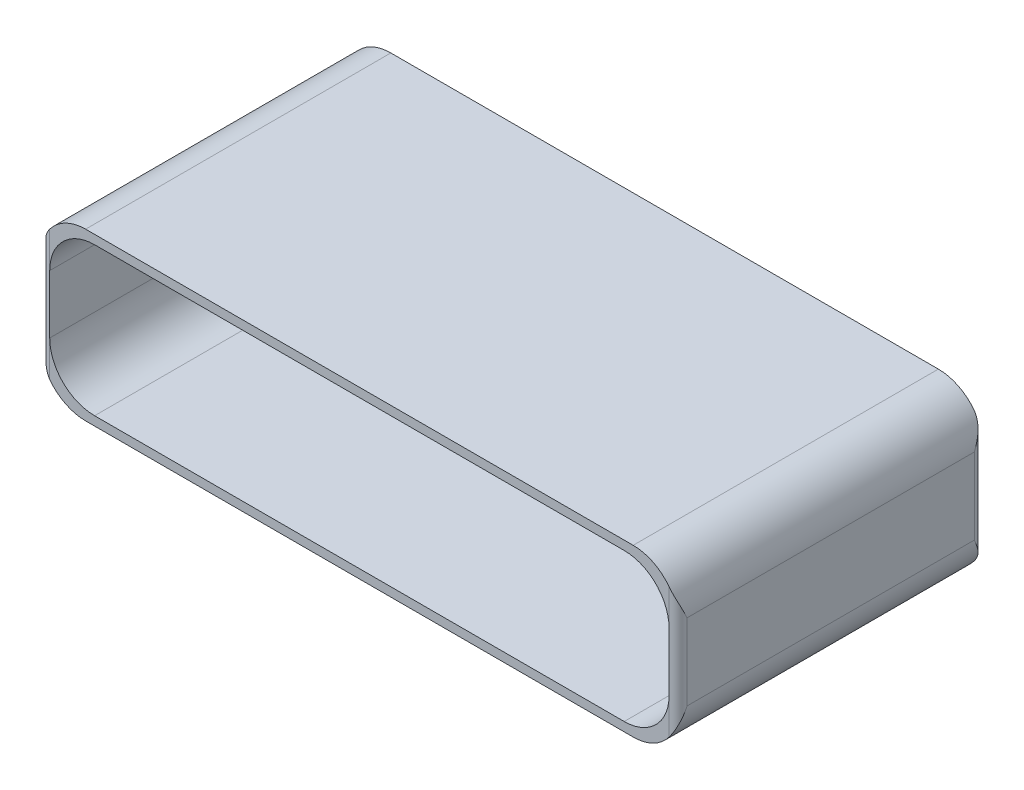
ISO-10303-21;
HEADER;
FILE_DESCRIPTION(('STEP AP214'),'2;1');
FILE_NAME('part.step','',(''),(''),'','','');
FILE_SCHEMA(('AUTOMOTIVE_DESIGN { 1 0 10303 214 1 1 1 1 }'));
ENDSEC;
DATA;
#1=APPLICATION_CONTEXT('core data for automotive mechanical design processes');
#2=APPLICATION_PROTOCOL_DEFINITION('international standard','automotive_design',2000,#1);
#3=PRODUCT_CONTEXT('',#1,'mechanical');
#4=PRODUCT('Part','Part','',(#3));
#5=PRODUCT_RELATED_PRODUCT_CATEGORY('part','',(#4));
#6=PRODUCT_DEFINITION_FORMATION('','',#4);
#7=PRODUCT_DEFINITION_CONTEXT('part definition',#1,'design');
#8=PRODUCT_DEFINITION('design','',#6,#7);
#9=PRODUCT_DEFINITION_SHAPE('','',#8);
#10=(LENGTH_UNIT() NAMED_UNIT(*) SI_UNIT(.MILLI.,.METRE.));
#11=(NAMED_UNIT(*) PLANE_ANGLE_UNIT() SI_UNIT($,.RADIAN.));
#12=(NAMED_UNIT(*) SI_UNIT($,.STERADIAN.) SOLID_ANGLE_UNIT());
#13=UNCERTAINTY_MEASURE_WITH_UNIT(LENGTH_MEASURE(1.E-05),#10,'distance_accuracy_value','');
#14=(GEOMETRIC_REPRESENTATION_CONTEXT(3) GLOBAL_UNCERTAINTY_ASSIGNED_CONTEXT((#13)) GLOBAL_UNIT_ASSIGNED_CONTEXT((#10,
#11,#12)) REPRESENTATION_CONTEXT('',''));
#15=CARTESIAN_POINT('',(0.,0.,0.));
#16=DIRECTION('',(0.,0.,1.));
#17=DIRECTION('',(1.,0.,0.));
#18=AXIS2_PLACEMENT_3D('',#15,#16,#17);
#19=CARTESIAN_POINT('',(-30.5,4.25,34.));
#20=DIRECTION('',(0.,0.,1.));
#21=DIRECTION('',(1.,0.,0.));
#22=AXIS2_PLACEMENT_3D('',#19,#20,#21);
#23=PLANE('',#22);
#24=DIRECTION('',(0.,1.,0.));
#25=VECTOR('',#24,1.);
#26=CARTESIAN_POINT('',(-34.5,-17.,34.));
#27=LINE('',#26,#25);
#28=CARTESIAN_POINT('',(-34.5,-7.25000000000001,34.));
#29=VERTEX_POINT('',#28);
#30=CARTESIAN_POINT('',(-34.5,-3.25,34.));
#31=VERTEX_POINT('',#30);
#32=EDGE_CURVE('E466',#29,#31,#27,.T.);
#33=ORIENTED_EDGE('',*,*,#32,.F.);
#34=CARTESIAN_POINT('',(-30.5,-4.25,34.));
#35=DIRECTION('',(0.,0.,1.));
#36=DIRECTION('',(-1.,0.,0.));
#37=AXIS2_PLACEMENT_3D('',#34,#35,#36);
#38=CIRCLE('',#37,5.);
#39=CARTESIAN_POINT('',(-30.5,-9.25,34.));
#40=VERTEX_POINT('',#39);
#41=EDGE_CURVE('E95',#29,#40,#38,.T.);
#42=ORIENTED_EDGE('',*,*,#41,.T.);
#43=DIRECTION('',(1.,0.,0.));
#44=VECTOR('',#43,1.);
#45=CARTESIAN_POINT('',(30.4999999999999,-9.24999999999999,34.));
#46=LINE('',#45,#44);
#47=CARTESIAN_POINT('',(30.4999999999999,-9.24999999999999,34.));
#48=VERTEX_POINT('',#47);
#49=EDGE_CURVE('E398',#40,#48,#46,.T.);
#50=ORIENTED_EDGE('',*,*,#49,.T.);
#51=CARTESIAN_POINT('',(30.5,-4.24999999999999,34.));
#52=DIRECTION('',(0.,0.,1.));
#53=DIRECTION('',(1.,0.,0.));
#54=AXIS2_PLACEMENT_3D('',#51,#52,#53);
#55=CIRCLE('',#54,5.);
#56=CARTESIAN_POINT('',(34.5,-7.25,34.));
#57=VERTEX_POINT('',#56);
#58=EDGE_CURVE('E400',#48,#57,#55,.T.);
#59=ORIENTED_EDGE('',*,*,#58,.T.);
#60=DIRECTION('',(0.,1.,0.));
#61=VECTOR('',#60,1.);
#62=CARTESIAN_POINT('',(34.5,-17.,34.));
#63=LINE('',#62,#61);
#64=CARTESIAN_POINT('',(34.5,-3.24999999999996,34.));
#65=VERTEX_POINT('',#64);
#66=EDGE_CURVE('E412',#57,#65,#63,.T.);
#67=ORIENTED_EDGE('',*,*,#66,.T.);
#68=CARTESIAN_POINT('',(29.5,-3.25,34.));
#69=DIRECTION('',(0.,0.,1.));
#70=DIRECTION('',(1.,0.,0.));
#71=AXIS2_PLACEMENT_3D('',#68,#69,#70);
#72=CIRCLE('',#71,5.);
#73=CARTESIAN_POINT('',(29.5,-8.25,34.));
#74=VERTEX_POINT('',#73);
#75=EDGE_CURVE('E352',#74,#65,#72,.T.);
#76=ORIENTED_EDGE('',*,*,#75,.F.);
#77=DIRECTION('',(1.,0.,0.));
#78=VECTOR('',#77,1.);
#79=CARTESIAN_POINT('',(29.5,-8.25,34.));
#80=LINE('',#79,#78);
#81=CARTESIAN_POINT('',(-29.5,-8.25,34.));
#82=VERTEX_POINT('',#81);
#83=EDGE_CURVE('E350',#82,#74,#80,.T.);
#84=ORIENTED_EDGE('',*,*,#83,.F.);
#85=CARTESIAN_POINT('',(-29.5,-3.25,34.));
#86=DIRECTION('',(0.,0.,1.));
#87=DIRECTION('',(-1.,0.,0.));
#88=AXIS2_PLACEMENT_3D('',#85,#86,#87);
#89=CIRCLE('',#88,5.);
#90=EDGE_CURVE('E348',#31,#82,#89,.T.);
#91=ORIENTED_EDGE('',*,*,#90,.F.);
#92=EDGE_LOOP('',(#33,#42,#50,#59,#67,#76,#84,#91));
#93=FACE_BOUND('',#92,.T.);
#94=ADVANCED_FACE('F45',(#93),#23,.T.);
#95=CARTESIAN_POINT('',(-34.5,3.24999999999997,34.));
#96=VERTEX_POINT('',#95);
#97=CARTESIAN_POINT('',(-34.5,7.25000000000001,34.));
#98=VERTEX_POINT('',#97);
#99=EDGE_CURVE('E469',#96,#98,#27,.T.);
#100=ORIENTED_EDGE('',*,*,#99,.F.);
#101=CARTESIAN_POINT('',(-29.5,3.25,34.));
#102=DIRECTION('',(0.,0.,1.));
#103=DIRECTION('',(1.,0.,0.));
#104=AXIS2_PLACEMENT_3D('',#101,#102,#103);
#105=CIRCLE('',#104,5.);
#106=CARTESIAN_POINT('',(-29.5,8.25,34.));
#107=VERTEX_POINT('',#106);
#108=EDGE_CURVE('E342',#107,#96,#105,.T.);
#109=ORIENTED_EDGE('',*,*,#108,.F.);
#110=DIRECTION('',(-1.,0.,0.));
#111=VECTOR('',#110,1.);
#112=CARTESIAN_POINT('',(29.5,8.25,34.));
#113=LINE('',#112,#111);
#114=CARTESIAN_POINT('',(29.5,8.25,34.));
#115=VERTEX_POINT('',#114);
#116=EDGE_CURVE('E339',#115,#107,#113,.T.);
#117=ORIENTED_EDGE('',*,*,#116,.F.);
#118=CARTESIAN_POINT('',(29.5,3.25,34.));
#119=DIRECTION('',(0.,0.,1.));
#120=DIRECTION('',(1.,0.,0.));
#121=AXIS2_PLACEMENT_3D('',#118,#119,#120);
#122=CIRCLE('',#121,5.);
#123=CARTESIAN_POINT('',(34.5,3.24999999999996,34.));
#124=VERTEX_POINT('',#123);
#125=EDGE_CURVE('E337',#124,#115,#122,.T.);
#126=ORIENTED_EDGE('',*,*,#125,.F.);
#127=CARTESIAN_POINT('',(34.5,7.25000000000002,34.));
#128=VERTEX_POINT('',#127);
#129=EDGE_CURVE('E464',#124,#128,#63,.T.);
#130=ORIENTED_EDGE('',*,*,#129,.T.);
#131=CARTESIAN_POINT('',(30.5,4.25000000000001,34.));
#132=DIRECTION('',(0.,0.,1.));
#133=DIRECTION('',(1.,0.,0.));
#134=AXIS2_PLACEMENT_3D('',#131,#132,#133);
#135=CIRCLE('',#134,5.);
#136=CARTESIAN_POINT('',(30.4999999999999,9.25000000000001,34.));
#137=VERTEX_POINT('',#136);
#138=EDGE_CURVE('E403',#128,#137,#135,.T.);
#139=ORIENTED_EDGE('',*,*,#138,.T.);
#140=DIRECTION('',(-1.,0.,0.));
#141=VECTOR('',#140,1.);
#142=CARTESIAN_POINT('',(30.4999999999999,9.25000000000001,34.));
#143=LINE('',#142,#141);
#144=CARTESIAN_POINT('',(-30.5,9.25,34.));
#145=VERTEX_POINT('',#144);
#146=EDGE_CURVE('E63',#137,#145,#143,.T.);
#147=ORIENTED_EDGE('',*,*,#146,.T.);
#148=CARTESIAN_POINT('',(-30.5,4.25,34.));
#149=DIRECTION('',(0.,0.,1.));
#150=DIRECTION('',(1.,0.,0.));
#151=AXIS2_PLACEMENT_3D('',#148,#149,#150);
#152=CIRCLE('',#151,5.);
#153=EDGE_CURVE('E233',#145,#98,#152,.T.);
#154=ORIENTED_EDGE('',*,*,#153,.T.);
#155=EDGE_LOOP('',(#100,#109,#117,#126,#130,#139,#147,#154));
#156=FACE_BOUND('',#155,.T.);
#157=ADVANCED_FACE('F435',(#156),#23,.T.);
#158=CARTESIAN_POINT('',(-30.5,4.25,0.));
#159=DIRECTION('',(0.,0.,1.));
#160=DIRECTION('',(1.,0.,0.));
#161=AXIS2_PLACEMENT_3D('',#158,#159,#160);
#162=PLANE('',#161);
#163=CARTESIAN_POINT('',(30.5,4.25000000000001,0.));
#164=DIRECTION('',(0.,0.,1.));
#165=DIRECTION('',(1.,0.,0.));
#166=AXIS2_PLACEMENT_3D('',#163,#164,#165);
#167=CIRCLE('',#166,5.);
#168=CARTESIAN_POINT('',(34.5,7.25000000000001,0.));
#169=VERTEX_POINT('',#168);
#170=CARTESIAN_POINT('',(30.4999999999999,9.25000000000001,0.));
#171=VERTEX_POINT('',#170);
#172=EDGE_CURVE('E81',#169,#171,#167,.T.);
#173=ORIENTED_EDGE('',*,*,#172,.F.);
#174=DIRECTION('',(0.,1.,0.));
#175=VECTOR('',#174,1.);
#176=CARTESIAN_POINT('',(34.5,-17.,0.));
#177=LINE('',#176,#175);
#178=CARTESIAN_POINT('',(34.5,3.24999999999996,0.));
#179=VERTEX_POINT('',#178);
#180=EDGE_CURVE('E217',#179,#169,#177,.T.);
#181=ORIENTED_EDGE('',*,*,#180,.F.);
#182=CARTESIAN_POINT('',(29.5,3.25,0.));
#183=DIRECTION('',(0.,0.,1.));
#184=DIRECTION('',(1.,0.,0.));
#185=AXIS2_PLACEMENT_3D('',#182,#183,#184);
#186=CIRCLE('',#185,5.);
#187=CARTESIAN_POINT('',(29.5,8.25,0.));
#188=VERTEX_POINT('',#187);
#189=EDGE_CURVE('E336',#179,#188,#186,.T.);
#190=ORIENTED_EDGE('',*,*,#189,.T.);
#191=DIRECTION('',(-1.,0.,0.));
#192=VECTOR('',#191,1.);
#193=CARTESIAN_POINT('',(29.5,8.25,0.));
#194=LINE('',#193,#192);
#195=CARTESIAN_POINT('',(-29.5,8.25,0.));
#196=VERTEX_POINT('',#195);
#197=EDGE_CURVE('E361',#188,#196,#194,.T.);
#198=ORIENTED_EDGE('',*,*,#197,.T.);
#199=CARTESIAN_POINT('',(-29.5,3.25,0.));
#200=DIRECTION('',(0.,0.,1.));
#201=DIRECTION('',(1.,0.,0.));
#202=AXIS2_PLACEMENT_3D('',#199,#200,#201);
#203=CIRCLE('',#202,5.);
#204=CARTESIAN_POINT('',(-34.5,3.24999999999997,0.));
#205=VERTEX_POINT('',#204);
#206=EDGE_CURVE('E364',#196,#205,#203,.T.);
#207=ORIENTED_EDGE('',*,*,#206,.T.);
#208=DIRECTION('',(0.,1.,0.));
#209=VECTOR('',#208,1.);
#210=CARTESIAN_POINT('',(-34.5,-17.,0.));
#211=LINE('',#210,#209);
#212=CARTESIAN_POINT('',(-34.5,7.25000000000001,0.));
#213=VERTEX_POINT('',#212);
#214=EDGE_CURVE('E268',#205,#213,#211,.T.);
#215=ORIENTED_EDGE('',*,*,#214,.T.);
#216=CARTESIAN_POINT('',(-30.5,4.25,0.));
#217=DIRECTION('',(0.,0.,1.));
#218=DIRECTION('',(1.,0.,0.));
#219=AXIS2_PLACEMENT_3D('',#216,#217,#218);
#220=CIRCLE('',#219,5.);
#221=CARTESIAN_POINT('',(-30.5,9.25,0.));
#222=VERTEX_POINT('',#221);
#223=EDGE_CURVE('E395',#222,#213,#220,.T.);
#224=ORIENTED_EDGE('',*,*,#223,.F.);
#225=DIRECTION('',(-1.,0.,0.));
#226=VECTOR('',#225,1.);
#227=CARTESIAN_POINT('',(30.4999999999999,9.25000000000001,0.));
#228=LINE('',#227,#226);
#229=EDGE_CURVE('E87',#171,#222,#228,.T.);
#230=ORIENTED_EDGE('',*,*,#229,.F.);
#231=EDGE_LOOP('',(#173,#181,#190,#198,#207,#215,#224,#230));
#232=FACE_BOUND('',#231,.T.);
#233=ADVANCED_FACE('F432',(#232),#162,.F.);
#234=CARTESIAN_POINT('',(-30.5,4.25,34.));
#235=DIRECTION('',(0.,0.,-1.));
#236=DIRECTION('',(-1.,0.,0.));
#237=AXIS2_PLACEMENT_3D('',#234,#235,#236);
#238=CYLINDRICAL_SURFACE('',#237,5.);
#239=CARTESIAN_POINT('',(-34.5,7.25000000000001,34.));
#240=CARTESIAN_POINT('',(-34.547304560907,7.18694469530648,33.9999628376629));
#241=CARTESIAN_POINT('',(-34.5930515988322,7.12282528320754,33.9966475188885));
#242=CARTESIAN_POINT('',(-34.6811677355869,6.99298227571153,33.9844642159685));
#243=CARTESIAN_POINT('',(-34.7235430910174,6.9272619618468,33.975606800219));
#244=CARTESIAN_POINT('',(-34.8045590614739,6.79494770540601,33.9534106318151));
#245=CARTESIAN_POINT('',(-34.8432230147052,6.72836268732807,33.9401026182386));
#246=CARTESIAN_POINT('',(-34.9171260446219,6.59411430702198,33.9097269176582));
#247=CARTESIAN_POINT('',(-34.9523628486698,6.52645026340857,33.8926567600438));
#248=CARTESIAN_POINT('',(-35.040738852702,6.34692992286538,33.8435310534268));
#249=CARTESIAN_POINT('',(-35.0909944731759,6.23436263846211,33.8088536971532));
#250=CARTESIAN_POINT('',(-35.1824784458444,6.00765553787584,33.7333093052933));
#251=CARTESIAN_POINT('',(-35.2237029602558,5.893515074983,33.6924396507109));
#252=CARTESIAN_POINT('',(-35.2975084908041,5.66369488013761,33.6059885385923));
#253=CARTESIAN_POINT('',(-35.3300552903853,5.54801088982806,33.5603893855202));
#254=CARTESIAN_POINT('',(-35.3865178315478,5.31592793495721,33.4659520382433));
#255=CARTESIAN_POINT('',(-35.4104363503651,5.19952921274147,33.4171148922729));
#256=CARTESIAN_POINT('',(-35.4531791346661,4.94652380572813,33.3088464332044));
#257=CARTESIAN_POINT('',(-35.4704595596891,4.80982611224998,33.2490194425743));
#258=CARTESIAN_POINT('',(-35.4936734801876,4.53637295871913,33.1280500788683));
#259=CARTESIAN_POINT('',(-35.4996304485303,4.39961820723367,33.0669106931352));
#260=CARTESIAN_POINT('',(-35.4999944415562,4.25860658611421,33.0038489814606));
#261=CARTESIAN_POINT('',(-35.4999999967753,4.25430326664144,33.0019244784261));
#262=CARTESIAN_POINT('',(-35.5,4.25,33.));
#263=B_SPLINE_CURVE_WITH_KNOTS('',3,(#239,#240,#241,#242,#243,#244,#245,#246,#247,#248,#249,
#250,#251,#252,#253,#254,#255,#256,#257,#258,#259,#260,#261,#262),.UNSPECIFIED.,.F.,.F.,(4,2,2,
2,2,2,2,2,2,2,2,4),(0.,0.236272200851107,0.472095214354656,0.706321989678204,0.940703043144727,
1.32429275355713,1.7080451561982,2.09328905143215,2.47840883504633,2.92860728181179,
3.37787147131306,3.39201361675779),.UNSPECIFIED.);
#264=CARTESIAN_POINT('',(-35.5,4.24999999999996,33.));
#265=VERTEX_POINT('',#264);
#266=EDGE_CURVE('E330',#98,#265,#263,.T.);
#267=ORIENTED_EDGE('',*,*,#266,.F.);
#268=ORIENTED_EDGE('',*,*,#153,.F.);
#269=DIRECTION('',(0.,0.,-1.));
#270=VECTOR('',#269,1.);
#271=CARTESIAN_POINT('',(-30.5,9.25,34.));
#272=LINE('',#271,#270);
#273=EDGE_CURVE('E234',#145,#222,#272,.T.);
#274=ORIENTED_EDGE('',*,*,#273,.T.);
#275=ORIENTED_EDGE('',*,*,#223,.T.);
#276=CARTESIAN_POINT('',(-34.5,7.25000000000001,0.));
#277=CARTESIAN_POINT('',(-34.547304560907,7.18694469530648,3.71623371143331E-05));
#278=CARTESIAN_POINT('',(-34.5930515988322,7.12282528320755,0.00335248111150576));
#279=CARTESIAN_POINT('',(-34.6811677355868,6.99298227571156,0.0155357840315038));
#280=CARTESIAN_POINT('',(-34.7235430910174,6.92726196184685,0.0243931997809878));
#281=CARTESIAN_POINT('',(-34.8045590614739,6.79494770540606,0.0465893681849235));
#282=CARTESIAN_POINT('',(-34.8432230147052,6.72836268732811,0.0598973817613526));
#283=CARTESIAN_POINT('',(-34.9171260446219,6.59411430702201,0.0902730823418164));
#284=CARTESIAN_POINT('',(-34.9523628486698,6.52645026340859,0.107343239956203));
#285=CARTESIAN_POINT('',(-35.040738852702,6.34692992286539,0.156468946573253));
#286=CARTESIAN_POINT('',(-35.0909944731759,6.2343626384621,0.191146302846761));
#287=CARTESIAN_POINT('',(-35.1824784458444,6.00765553787583,0.266690694706754));
#288=CARTESIAN_POINT('',(-35.2237029602558,5.89351507498298,0.307560349289161));
#289=CARTESIAN_POINT('',(-35.2975084908041,5.6636948801376,0.394011461407672));
#290=CARTESIAN_POINT('',(-35.3300552903853,5.54801088982806,0.439610614479828));
#291=CARTESIAN_POINT('',(-35.3865178315478,5.31592793495722,0.534047961756752));
#292=CARTESIAN_POINT('',(-35.4104363503651,5.19952921274151,0.582885107727156));
#293=CARTESIAN_POINT('',(-35.4531791346661,4.94652380572812,0.691153566795504));
#294=CARTESIAN_POINT('',(-35.4704595596891,4.80982611224989,0.750980557425469));
#295=CARTESIAN_POINT('',(-35.4936734801876,4.53637295871925,0.871949921131985));
#296=CARTESIAN_POINT('',(-35.4996304485303,4.39961820723408,0.933089306865717));
#297=CARTESIAN_POINT('',(-35.4999944415562,4.25860658611424,0.996151018539433));
#298=CARTESIAN_POINT('',(-35.4999999967753,4.25430326664145,0.99807552157391));
#299=CARTESIAN_POINT('',(-35.5,4.25,1.));
#300=B_SPLINE_CURVE_WITH_KNOTS('',3,(#276,#277,#278,#279,#280,#281,#282,#283,#284,#285,#286,
#287,#288,#289,#290,#291,#292,#293,#294,#295,#296,#297,#298,#299),.UNSPECIFIED.,.F.,.F.,(4,2,2,
2,2,2,2,2,2,2,2,4),(0.,0.236272200851073,0.472095214354591,0.706321989678164,0.940703043144714,
1.32429275355714,1.70804515619822,2.09328905143214,2.4784088350463,2.92860728181177,
3.37787147131306,3.39201361675779),.UNSPECIFIED.);
#301=CARTESIAN_POINT('',(-35.5,4.24999999999996,1.00000000000001));
#302=VERTEX_POINT('',#301);
#303=EDGE_CURVE('E415',#302,#213,#300,.F.);
#304=ORIENTED_EDGE('',*,*,#303,.F.);
#305=DIRECTION('',(0.,0.,-1.));
#306=VECTOR('',#305,1.);
#307=CARTESIAN_POINT('',(-35.5,4.24999999999996,34.));
#308=LINE('',#307,#306);
#309=EDGE_CURVE('E11',#265,#302,#308,.T.);
#310=ORIENTED_EDGE('',*,*,#309,.F.);
#311=EDGE_LOOP('',(#267,#268,#274,#275,#304,#310));
#312=FACE_BOUND('',#311,.T.);
#313=ADVANCED_FACE('F47',(#312),#238,.T.);
#314=CARTESIAN_POINT('',(-35.5,-4.24999999999997,34.));
#315=DIRECTION('',(1.,0.,0.));
#316=DIRECTION('',(0.,0.,-1.));
#317=AXIS2_PLACEMENT_3D('',#314,#315,#316);
#318=PLANE('',#317);
#319=DIRECTION('',(0.,0.,-1.));
#320=VECTOR('',#319,1.);
#321=CARTESIAN_POINT('',(-35.5,-4.25,34.));
#322=LINE('',#321,#320);
#323=CARTESIAN_POINT('',(-35.5,-4.25,33.));
#324=VERTEX_POINT('',#323);
#325=CARTESIAN_POINT('',(-35.5,-4.25,1.00000000000001));
#326=VERTEX_POINT('',#325);
#327=EDGE_CURVE('E55',#324,#326,#322,.T.);
#328=ORIENTED_EDGE('',*,*,#327,.F.);
#329=DIRECTION('',(0.,1.,0.));
#330=VECTOR('',#329,1.);
#331=CARTESIAN_POINT('',(-35.5,-17.,33.));
#332=LINE('',#331,#330);
#333=EDGE_CURVE('E259',#324,#265,#332,.T.);
#334=ORIENTED_EDGE('',*,*,#333,.T.);
#335=ORIENTED_EDGE('',*,*,#309,.T.);
#336=DIRECTION('',(0.,1.,0.));
#337=VECTOR('',#336,1.);
#338=CARTESIAN_POINT('',(-35.5,-17.,1.00000000000001));
#339=LINE('',#338,#337);
#340=EDGE_CURVE('E261',#326,#302,#339,.T.);
#341=ORIENTED_EDGE('',*,*,#340,.F.);
#342=EDGE_LOOP('',(#328,#334,#335,#341));
#343=FACE_BOUND('',#342,.T.);
#344=ADVANCED_FACE('F258',(#343),#318,.F.);
#345=CARTESIAN_POINT('',(-30.5,-4.25,34.));
#346=DIRECTION('',(0.,0.,-1.));
#347=DIRECTION('',(-1.,0.,0.));
#348=AXIS2_PLACEMENT_3D('',#345,#346,#347);
#349=CYLINDRICAL_SURFACE('',#348,5.);
#350=CARTESIAN_POINT('',(-34.5,-7.25000000000001,34.));
#351=CARTESIAN_POINT('',(-34.5473045609069,-7.18694469530651,33.9999628376629));
#352=CARTESIAN_POINT('',(-34.5930515988322,-7.12282528320759,33.9966475188885));
#353=CARTESIAN_POINT('',(-34.6811677355868,-6.99298227571163,33.9844642159685));
#354=CARTESIAN_POINT('',(-34.7235430910173,-6.92726196184694,33.975606800219));
#355=CARTESIAN_POINT('',(-34.8045590614738,-6.79494770540615,33.9534106318151));
#356=CARTESIAN_POINT('',(-34.8432230147052,-6.72836268732818,33.9401026182387));
#357=CARTESIAN_POINT('',(-34.9171260446219,-6.59411430702204,33.9097269176582));
#358=CARTESIAN_POINT('',(-34.9523628486698,-6.52645026340861,33.8926567600438));
#359=CARTESIAN_POINT('',(-35.040738852702,-6.34692992286537,33.8435310534267));
#360=CARTESIAN_POINT('',(-35.0909944731759,-6.23436263846208,33.8088536971532));
#361=CARTESIAN_POINT('',(-35.1824784458444,-6.00765553787577,33.7333093052932));
#362=CARTESIAN_POINT('',(-35.2237029602558,-5.89351507498293,33.6924396507108));
#363=CARTESIAN_POINT('',(-35.2975084908041,-5.66369488013754,33.6059885385923));
#364=CARTESIAN_POINT('',(-35.3300552903853,-5.54801088982799,33.5603893855202));
#365=CARTESIAN_POINT('',(-35.3865178315478,-5.31592793495721,33.4659520382432));
#366=CARTESIAN_POINT('',(-35.4104363503651,-5.19952921274155,33.4171148922727));
#367=CARTESIAN_POINT('',(-35.4531791346661,-4.94652380572806,33.3088464332046));
#368=CARTESIAN_POINT('',(-35.4704595596891,-4.80982611224965,33.2490194425751));
#369=CARTESIAN_POINT('',(-35.4936734801876,-4.5363729587195,33.1280500788675));
#370=CARTESIAN_POINT('',(-35.4996304485303,-4.399618207235,33.0669106931323));
#371=CARTESIAN_POINT('',(-35.4999944415562,-4.2586065861143,33.0038489814604));
#372=CARTESIAN_POINT('',(-35.4999999967753,-4.25430326664148,33.001924478426));
#373=CARTESIAN_POINT('',(-35.5,-4.25,33.));
#374=B_SPLINE_CURVE_WITH_KNOTS('',3,(#350,#351,#352,#353,#354,#355,#356,#357,#358,#359,#360,
#361,#362,#363,#364,#365,#366,#367,#368,#369,#370,#371,#372,#373),.UNSPECIFIED.,.F.,.F.,(4,2,2,
2,2,2,2,2,2,2,2,4),(0.,0.236272200851015,0.472095214354472,0.706321989678106,0.940703043144723,
1.32429275355719,1.70804515619831,2.09328905143218,2.47840883504631,2.92860728181178,
3.37787147131307,3.39201361675779),.UNSPECIFIED.);
#375=EDGE_CURVE('E254',#324,#29,#374,.F.);
#376=ORIENTED_EDGE('',*,*,#375,.F.);
#377=ORIENTED_EDGE('',*,*,#327,.T.);
#378=CARTESIAN_POINT('',(-34.5,-7.25000000000001,0.));
#379=CARTESIAN_POINT('',(-34.5473045609069,-7.18694469530651,3.71623371144666E-05));
#380=CARTESIAN_POINT('',(-34.5930515988322,-7.1228252832076,0.00335248111150362));
#381=CARTESIAN_POINT('',(-34.6811677355868,-6.99298227571166,0.0155357840314932));
#382=CARTESIAN_POINT('',(-34.7235430910173,-6.92726196184698,0.0243931997809708));
#383=CARTESIAN_POINT('',(-34.8045590614738,-6.79494770540619,0.0465893681848992));
#384=CARTESIAN_POINT('',(-34.8432230147051,-6.72836268732822,0.0598973817613309));
#385=CARTESIAN_POINT('',(-34.9171260446219,-6.59411430702206,0.0902730823418035));
#386=CARTESIAN_POINT('',(-34.9523628486698,-6.52645026340863,0.107343239956196));
#387=CARTESIAN_POINT('',(-35.040738852702,-6.34692992286538,0.156468946573257));
#388=CARTESIAN_POINT('',(-35.0909944731759,-6.23436263846208,0.191146302846769));
#389=CARTESIAN_POINT('',(-35.1824784458444,-6.00765553787577,0.26669069470678));
#390=CARTESIAN_POINT('',(-35.2237029602559,-5.89351507498292,0.307560349289202));
#391=CARTESIAN_POINT('',(-35.2975084908041,-5.66369488013753,0.394011461407691));
#392=CARTESIAN_POINT('',(-35.3300552903853,-5.54801088982798,0.439610614479808));
#393=CARTESIAN_POINT('',(-35.3865178315478,-5.31592793495722,0.534047961756808));
#394=CARTESIAN_POINT('',(-35.4104363503651,-5.19952921274158,0.582885107727326));
#395=CARTESIAN_POINT('',(-35.4531791346661,-4.94652380572805,0.691153566795312));
#396=CARTESIAN_POINT('',(-35.4704595596891,-4.80982611224956,0.750980557424697));
#397=CARTESIAN_POINT('',(-35.4936734801876,-4.53637295871961,0.871949921132758));
#398=CARTESIAN_POINT('',(-35.4996304485303,-4.39961820723539,0.933089306868609));
#399=CARTESIAN_POINT('',(-35.4999944415562,-4.25860658611432,0.996151018539614));
#400=CARTESIAN_POINT('',(-35.4999999967753,-4.2543032666415,0.998075521574002));
#401=CARTESIAN_POINT('',(-35.5,-4.25,1.));
#402=B_SPLINE_CURVE_WITH_KNOTS('',3,(#378,#379,#380,#381,#382,#383,#384,#385,#386,#387,#388,
#389,#390,#391,#392,#393,#394,#395,#396,#397,#398,#399,#400,#401),.UNSPECIFIED.,.F.,.F.,(4,2,2,
2,2,2,2,2,2,2,2,4),(0.,0.23627220085099,0.472095214354416,0.706321989678074,0.940703043144714,
1.3242927535572,1.70804515619832,2.09328905143218,2.47840883504629,2.92860728181176,
3.37787147131307,3.39201361675779),.UNSPECIFIED.);
#403=CARTESIAN_POINT('',(-34.5,-7.25000000000001,0.));
#404=VERTEX_POINT('',#403);
#405=EDGE_CURVE('E252',#404,#326,#402,.T.);
#406=ORIENTED_EDGE('',*,*,#405,.F.);
#407=CARTESIAN_POINT('',(-30.5,-4.25,0.));
#408=DIRECTION('',(0.,0.,1.));
#409=DIRECTION('',(-1.,0.,0.));
#410=AXIS2_PLACEMENT_3D('',#407,#408,#409);
#411=CIRCLE('',#410,5.);
#412=CARTESIAN_POINT('',(-30.5,-9.25,0.));
#413=VERTEX_POINT('',#412);
#414=EDGE_CURVE('E228',#404,#413,#411,.T.);
#415=ORIENTED_EDGE('',*,*,#414,.T.);
#416=DIRECTION('',(0.,0.,-1.));
#417=VECTOR('',#416,1.);
#418=CARTESIAN_POINT('',(-30.5,-9.25,34.));
#419=LINE('',#418,#417);
#420=EDGE_CURVE('E244',#40,#413,#419,.T.);
#421=ORIENTED_EDGE('',*,*,#420,.F.);
#422=ORIENTED_EDGE('',*,*,#41,.F.);
#423=EDGE_LOOP('',(#376,#377,#406,#415,#421,#422));
#424=FACE_BOUND('',#423,.T.);
#425=ADVANCED_FACE('F251',(#424),#349,.T.);
#426=CARTESIAN_POINT('',(30.5,-4.24999999999999,34.));
#427=DIRECTION('',(0.,0.,-1.));
#428=DIRECTION('',(-1.,0.,0.));
#429=AXIS2_PLACEMENT_3D('',#426,#427,#428);
#430=CYLINDRICAL_SURFACE('',#429,5.);
#431=CARTESIAN_POINT('',(34.5,-7.25,34.));
#432=CARTESIAN_POINT('',(34.5473045609069,-7.18694469530647,33.9999628376629));
#433=CARTESIAN_POINT('',(34.5930515988322,-7.12282528320753,33.9966475188885));
#434=CARTESIAN_POINT('',(34.6811677355868,-6.99298227571152,33.9844642159685));
#435=CARTESIAN_POINT('',(34.7235430910174,-6.9272619618468,33.975606800219));
#436=CARTESIAN_POINT('',(34.8045590614739,-6.79494770540601,33.9534106318151));
#437=CARTESIAN_POINT('',(34.8432230147052,-6.72836268732807,33.9401026182386));
#438=CARTESIAN_POINT('',(34.9171260446219,-6.59411430702198,33.9097269176582));
#439=CARTESIAN_POINT('',(34.9523628486697,-6.52645026340858,33.8926567600438));
#440=CARTESIAN_POINT('',(35.040738852702,-6.34692992286538,33.8435310534268));
#441=CARTESIAN_POINT('',(35.0909944731758,-6.23436263846211,33.8088536971532));
#442=CARTESIAN_POINT('',(35.1824784458444,-6.00765553787583,33.7333093052933));
#443=CARTESIAN_POINT('',(35.2237029602558,-5.89351507498299,33.6924396507109));
#444=CARTESIAN_POINT('',(35.2975084908041,-5.66369488013761,33.6059885385923));
#445=CARTESIAN_POINT('',(35.3300552903853,-5.54801088982807,33.5603893855202));
#446=CARTESIAN_POINT('',(35.3865178315478,-5.31592793495721,33.4659520382433));
#447=CARTESIAN_POINT('',(35.4104363503651,-5.19952921274148,33.4171148922729));
#448=CARTESIAN_POINT('',(35.4531791346661,-4.94652380572813,33.3088464332044));
#449=CARTESIAN_POINT('',(35.4704595596891,-4.80982611224998,33.2490194425743));
#450=CARTESIAN_POINT('',(35.4936734801876,-4.53637295871913,33.1280500788683));
#451=CARTESIAN_POINT('',(35.4996304485303,-4.39961820723366,33.0669106931352));
#452=CARTESIAN_POINT('',(35.4999944415562,-4.25860658611421,33.0038489814606));
#453=CARTESIAN_POINT('',(35.4999999967752,-4.25430326664144,33.0019244784261));
#454=CARTESIAN_POINT('',(35.5,-4.24999999999999,33.));
#455=B_SPLINE_CURVE_WITH_KNOTS('',3,(#431,#432,#433,#434,#435,#436,#437,#438,#439,#440,#441,
#442,#443,#444,#445,#446,#447,#448,#449,#450,#451,#452,#453,#454),.UNSPECIFIED.,.F.,.F.,(4,2,2,
2,2,2,2,2,2,2,2,4),(0.,0.236272200851109,0.472095214354657,0.706321989678198,0.940703043144723,
1.32429275355713,1.70804515619819,2.09328905143214,2.47840883504632,2.92860728181178,
3.37787147131306,3.39201361675779),.UNSPECIFIED.);
#456=CARTESIAN_POINT('',(35.5,-4.24999999999996,33.));
#457=VERTEX_POINT('',#456);
#458=EDGE_CURVE('E301',#57,#457,#455,.T.);
#459=ORIENTED_EDGE('',*,*,#458,.F.);
#460=ORIENTED_EDGE('',*,*,#58,.F.);
#461=DIRECTION('',(0.,0.,-1.));
#462=VECTOR('',#461,1.);
#463=CARTESIAN_POINT('',(30.4999999999999,-9.24999999999999,34.));
#464=LINE('',#463,#462);
#465=CARTESIAN_POINT('',(30.4999999999999,-9.24999999999999,0.));
#466=VERTEX_POINT('',#465);
#467=EDGE_CURVE('E224',#48,#466,#464,.T.);
#468=ORIENTED_EDGE('',*,*,#467,.T.);
#469=CARTESIAN_POINT('',(30.5,-4.24999999999999,0.));
#470=DIRECTION('',(0.,0.,1.));
#471=DIRECTION('',(1.,0.,0.));
#472=AXIS2_PLACEMENT_3D('',#469,#470,#471);
#473=CIRCLE('',#472,5.);
#474=CARTESIAN_POINT('',(34.5,-7.25,0.));
#475=VERTEX_POINT('',#474);
#476=EDGE_CURVE('E213',#466,#475,#473,.T.);
#477=ORIENTED_EDGE('',*,*,#476,.T.);
#478=CARTESIAN_POINT('',(34.5,-7.25,0.));
#479=CARTESIAN_POINT('',(34.5473045609069,-7.18694469530648,3.71623371143113E-05));
#480=CARTESIAN_POINT('',(34.5930515988322,-7.12282528320755,0.0033524811115057));
#481=CARTESIAN_POINT('',(34.6811677355868,-6.99298227571156,0.0155357840315037));
#482=CARTESIAN_POINT('',(34.7235430910174,-6.92726196184685,0.0243931997809876));
#483=CARTESIAN_POINT('',(34.8045590614738,-6.79494770540606,0.0465893681849234));
#484=CARTESIAN_POINT('',(34.8432230147052,-6.72836268732811,0.0598973817613526));
#485=CARTESIAN_POINT('',(34.9171260446219,-6.594114307022,0.0902730823418163));
#486=CARTESIAN_POINT('',(34.9523628486697,-6.52645026340859,0.107343239956203));
#487=CARTESIAN_POINT('',(35.040738852702,-6.34692992286538,0.156468946573252));
#488=CARTESIAN_POINT('',(35.0909944731758,-6.2343626384621,0.191146302846761));
#489=CARTESIAN_POINT('',(35.1824784458444,-6.00765553787582,0.266690694706754));
#490=CARTESIAN_POINT('',(35.2237029602558,-5.89351507498298,0.30756034928916));
#491=CARTESIAN_POINT('',(35.2975084908041,-5.6636948801376,0.394011461407672));
#492=CARTESIAN_POINT('',(35.3300552903853,-5.54801088982805,0.439610614479829));
#493=CARTESIAN_POINT('',(35.3865178315478,-5.31592793495722,0.534047961756754));
#494=CARTESIAN_POINT('',(35.4104363503651,-5.19952921274151,0.582885107727157));
#495=CARTESIAN_POINT('',(35.4531791346661,-4.94652380572812,0.691153566795503));
#496=CARTESIAN_POINT('',(35.4704595596891,-4.80982611224988,0.750980557425469));
#497=CARTESIAN_POINT('',(35.4936734801876,-4.53637295871925,0.871949921131985));
#498=CARTESIAN_POINT('',(35.4996304485303,-4.39961820723408,0.933089306865717));
#499=CARTESIAN_POINT('',(35.4999944415562,-4.25860658611423,0.996151018539433));
#500=CARTESIAN_POINT('',(35.4999999967752,-4.25430326664145,0.99807552157391));
#501=CARTESIAN_POINT('',(35.5,-4.24999999999999,1.));
#502=B_SPLINE_CURVE_WITH_KNOTS('',3,(#478,#479,#480,#481,#482,#483,#484,#485,#486,#487,#488,
#489,#490,#491,#492,#493,#494,#495,#496,#497,#498,#499,#500,#501),.UNSPECIFIED.,.F.,.F.,(4,2,2,
2,2,2,2,2,2,2,2,4),(0.,0.236272200851073,0.472095214354591,0.706321989678165,0.940703043144715,
1.32429275355714,1.70804515619822,2.09328905143214,2.4784088350463,2.92860728181177,
3.37787147131307,3.39201361675779),.UNSPECIFIED.);
#503=CARTESIAN_POINT('',(35.5,-4.24999999999996,1.00000000000001));
#504=VERTEX_POINT('',#503);
#505=EDGE_CURVE('E194',#475,#504,#502,.T.);
#506=ORIENTED_EDGE('',*,*,#505,.T.);
#507=DIRECTION('',(0.,0.,-1.));
#508=VECTOR('',#507,1.);
#509=CARTESIAN_POINT('',(35.5,-4.24999999999996,34.));
#510=LINE('',#509,#508);
#511=EDGE_CURVE('E241',#457,#504,#510,.T.);
#512=ORIENTED_EDGE('',*,*,#511,.F.);
#513=EDGE_LOOP('',(#459,#460,#468,#477,#506,#512));
#514=FACE_BOUND('',#513,.T.);
#515=ADVANCED_FACE('F221',(#514),#430,.T.);
#516=CARTESIAN_POINT('',(35.5,-4.24999999999996,34.));
#517=DIRECTION('',(-1.,0.,0.));
#518=DIRECTION('',(0.,0.,1.));
#519=AXIS2_PLACEMENT_3D('',#516,#517,#518);
#520=PLANE('',#519);
#521=DIRECTION('',(0.,1.,0.));
#522=VECTOR('',#521,1.);
#523=CARTESIAN_POINT('',(35.5,-17.,33.));
#524=LINE('',#523,#522);
#525=CARTESIAN_POINT('',(35.5,4.25,33.));
#526=VERTEX_POINT('',#525);
#527=EDGE_CURVE('E468',#457,#526,#524,.T.);
#528=ORIENTED_EDGE('',*,*,#527,.F.);
#529=ORIENTED_EDGE('',*,*,#511,.T.);
#530=DIRECTION('',(0.,1.,0.));
#531=VECTOR('',#530,1.);
#532=CARTESIAN_POINT('',(35.5,-17.,1.00000000000001));
#533=LINE('',#532,#531);
#534=CARTESIAN_POINT('',(35.5,4.25,1.00000000000001));
#535=VERTEX_POINT('',#534);
#536=EDGE_CURVE('E200',#504,#535,#533,.T.);
#537=ORIENTED_EDGE('',*,*,#536,.T.);
#538=DIRECTION('',(0.,0.,-1.));
#539=VECTOR('',#538,1.);
#540=CARTESIAN_POINT('',(35.5,4.24999999999997,34.));
#541=LINE('',#540,#539);
#542=EDGE_CURVE('E238',#526,#535,#541,.T.);
#543=ORIENTED_EDGE('',*,*,#542,.F.);
#544=EDGE_LOOP('',(#528,#529,#537,#543));
#545=FACE_BOUND('',#544,.T.);
#546=ADVANCED_FACE('F292',(#545),#520,.F.);
#547=CARTESIAN_POINT('',(30.5,4.25000000000001,34.));
#548=DIRECTION('',(0.,0.,-1.));
#549=DIRECTION('',(-1.,0.,0.));
#550=AXIS2_PLACEMENT_3D('',#547,#548,#549);
#551=CYLINDRICAL_SURFACE('',#550,5.);
#552=CARTESIAN_POINT('',(34.5,7.25000000000002,34.));
#553=CARTESIAN_POINT('',(34.5473045609069,7.18694469530651,33.9999628376629));
#554=CARTESIAN_POINT('',(34.5930515988321,7.12282528320759,33.9966475188885));
#555=CARTESIAN_POINT('',(34.6811677355868,6.99298227571164,33.9844642159685));
#556=CARTESIAN_POINT('',(34.7235430910173,6.92726196184694,33.975606800219));
#557=CARTESIAN_POINT('',(34.8045590614738,6.79494770540615,33.9534106318151));
#558=CARTESIAN_POINT('',(34.8432230147051,6.72836268732819,33.9401026182387));
#559=CARTESIAN_POINT('',(34.9171260446219,6.59411430702204,33.9097269176582));
#560=CARTESIAN_POINT('',(34.9523628486697,6.52645026340861,33.8926567600438));
#561=CARTESIAN_POINT('',(35.040738852702,6.34692992286537,33.8435310534267));
#562=CARTESIAN_POINT('',(35.0909944731758,6.23436263846207,33.8088536971532));
#563=CARTESIAN_POINT('',(35.1824784458444,6.00765553787577,33.7333093052932));
#564=CARTESIAN_POINT('',(35.2237029602558,5.89351507498292,33.6924396507108));
#565=CARTESIAN_POINT('',(35.2975084908041,5.66369488013753,33.6059885385923));
#566=CARTESIAN_POINT('',(35.3300552903853,5.54801088982799,33.5603893855202));
#567=CARTESIAN_POINT('',(35.3865178315478,5.31592793495721,33.4659520382432));
#568=CARTESIAN_POINT('',(35.4104363503651,5.19952921274155,33.4171148922727));
#569=CARTESIAN_POINT('',(35.4531791346661,4.94652380572805,33.3088464332046));
#570=CARTESIAN_POINT('',(35.4704595596891,4.80982611224962,33.2490194425751));
#571=CARTESIAN_POINT('',(35.4936734801876,4.53637295871952,33.1280500788674));
#572=CARTESIAN_POINT('',(35.4996304485303,4.39961820723507,33.0669106931321));
#573=CARTESIAN_POINT('',(35.4999944415562,4.2586065861143,33.0038489814604));
#574=CARTESIAN_POINT('',(35.4999999967752,4.25430326664149,33.001924478426));
#575=CARTESIAN_POINT('',(35.5,4.25000000000001,33.));
#576=B_SPLINE_CURVE_WITH_KNOTS('',3,(#552,#553,#554,#555,#556,#557,#558,#559,#560,#561,#562,
#563,#564,#565,#566,#567,#568,#569,#570,#571,#572,#573,#574,#575),.UNSPECIFIED.,.F.,.F.,(4,2,2,
2,2,2,2,2,2,2,2,4),(0.,0.236272200851012,0.472095214354467,0.706321989678105,0.940703043144725,
1.3242927535572,1.70804515619832,2.0932890514322,2.47840883504632,2.92860728181178,
3.37787147131307,3.39201361675779),.UNSPECIFIED.);
#577=EDGE_CURVE('E205',#526,#128,#576,.F.);
#578=ORIENTED_EDGE('',*,*,#577,.F.);
#579=ORIENTED_EDGE('',*,*,#542,.T.);
#580=CARTESIAN_POINT('',(34.5,7.25000000000002,0.));
#581=CARTESIAN_POINT('',(34.5473045609069,7.18694469530652,3.71623371139929E-05));
#582=CARTESIAN_POINT('',(34.5930515988321,7.12282528320761,0.00335248111150328));
#583=CARTESIAN_POINT('',(34.6811677355867,6.99298227571166,0.0155357840314934));
#584=CARTESIAN_POINT('',(34.7235430910173,6.92726196184698,0.0243931997809712));
#585=CARTESIAN_POINT('',(34.8045590614738,6.79494770540619,0.0465893681848994));
#586=CARTESIAN_POINT('',(34.8432230147051,6.72836268732822,0.0598973817613306));
#587=CARTESIAN_POINT('',(34.9171260446218,6.59411430702207,0.0902730823418031));
#588=CARTESIAN_POINT('',(34.9523628486697,6.52645026340863,0.107343239956197));
#589=CARTESIAN_POINT('',(35.040738852702,6.34692992286538,0.156468946573258));
#590=CARTESIAN_POINT('',(35.0909944731758,6.23436263846208,0.19114630284677));
#591=CARTESIAN_POINT('',(35.1824784458444,6.00765553787577,0.266690694706781));
#592=CARTESIAN_POINT('',(35.2237029602558,5.89351507498292,0.307560349289202));
#593=CARTESIAN_POINT('',(35.2975084908041,5.66369488013753,0.394011461407693));
#594=CARTESIAN_POINT('',(35.3300552903853,5.54801088982799,0.439610614479811));
#595=CARTESIAN_POINT('',(35.3865178315478,5.31592793495723,0.534047961756809));
#596=CARTESIAN_POINT('',(35.4104363503651,5.19952921274158,0.582885107727324));
#597=CARTESIAN_POINT('',(35.4531791346661,4.94652380572805,0.691153566795314));
#598=CARTESIAN_POINT('',(35.4704595596891,4.80982611224956,0.750980557424709));
#599=CARTESIAN_POINT('',(35.4936734801876,4.53637295871961,0.871949921132748));
#600=CARTESIAN_POINT('',(35.4996304485303,4.39961820723537,0.933089306868569));
#601=CARTESIAN_POINT('',(35.4999944415562,4.25860658611432,0.996151018539611));
#602=CARTESIAN_POINT('',(35.4999999967752,4.2543032666415,0.998075521574001));
#603=CARTESIAN_POINT('',(35.5,4.25000000000001,1.));
#604=B_SPLINE_CURVE_WITH_KNOTS('',3,(#580,#581,#582,#583,#584,#585,#586,#587,#588,#589,#590,
#591,#592,#593,#594,#595,#596,#597,#598,#599,#600,#601,#602,#603),.UNSPECIFIED.,.F.,.F.,(4,2,2,
2,2,2,2,2,2,2,2,4),(0.,0.236272200850994,0.472095214354417,0.706321989678072,0.940703043144717,
1.3242927535572,1.70804515619832,2.09328905143218,2.47840883504629,2.92860728181176,
3.37787147131307,3.39201361675779),.UNSPECIFIED.);
#605=EDGE_CURVE('E206',#535,#169,#604,.F.);
#606=ORIENTED_EDGE('',*,*,#605,.T.);
#607=ORIENTED_EDGE('',*,*,#172,.T.);
#608=DIRECTION('',(0.,0.,-1.));
#609=VECTOR('',#608,1.);
#610=CARTESIAN_POINT('',(30.4999999999999,9.25000000000001,34.));
#611=LINE('',#610,#609);
#612=EDGE_CURVE('E236',#137,#171,#611,.T.);
#613=ORIENTED_EDGE('',*,*,#612,.F.);
#614=ORIENTED_EDGE('',*,*,#138,.F.);
#615=EDGE_LOOP('',(#578,#579,#606,#607,#613,#614));
#616=FACE_BOUND('',#615,.T.);
#617=ADVANCED_FACE('F287',(#616),#551,.T.);
#618=CARTESIAN_POINT('',(29.5,-3.25,0.));
#619=DIRECTION('',(0.,0.,1.));
#620=DIRECTION('',(1.,0.,0.));
#621=AXIS2_PLACEMENT_3D('',#618,#619,#620);
#622=CIRCLE('',#621,5.);
#623=CARTESIAN_POINT('',(29.5,-8.25,0.));
#624=VERTEX_POINT('',#623);
#625=CARTESIAN_POINT('',(34.5,-3.24999999999997,0.));
#626=VERTEX_POINT('',#625);
#627=EDGE_CURVE('E216',#624,#626,#622,.T.);
#628=ORIENTED_EDGE('',*,*,#627,.T.);
#629=EDGE_CURVE('E197',#475,#626,#177,.T.);
#630=ORIENTED_EDGE('',*,*,#629,.F.);
#631=ORIENTED_EDGE('',*,*,#476,.F.);
#632=DIRECTION('',(1.,0.,0.));
#633=VECTOR('',#632,1.);
#634=CARTESIAN_POINT('',(30.4999999999999,-9.24999999999999,0.));
#635=LINE('',#634,#633);
#636=EDGE_CURVE('E225',#413,#466,#635,.T.);
#637=ORIENTED_EDGE('',*,*,#636,.F.);
#638=ORIENTED_EDGE('',*,*,#414,.F.);
#639=CARTESIAN_POINT('',(-34.5,-3.25,0.));
#640=VERTEX_POINT('',#639);
#641=EDGE_CURVE('E264',#404,#640,#211,.T.);
#642=ORIENTED_EDGE('',*,*,#641,.T.);
#643=CARTESIAN_POINT('',(-29.5,-3.25,0.));
#644=DIRECTION('',(0.,0.,1.));
#645=DIRECTION('',(-1.,0.,0.));
#646=AXIS2_PLACEMENT_3D('',#643,#644,#645);
#647=CIRCLE('',#646,5.);
#648=CARTESIAN_POINT('',(-29.5,-8.25,0.));
#649=VERTEX_POINT('',#648);
#650=EDGE_CURVE('E369',#640,#649,#647,.T.);
#651=ORIENTED_EDGE('',*,*,#650,.T.);
#652=DIRECTION('',(1.,0.,0.));
#653=VECTOR('',#652,1.);
#654=CARTESIAN_POINT('',(29.5,-8.25,0.));
#655=LINE('',#654,#653);
#656=EDGE_CURVE('E372',#649,#624,#655,.T.);
#657=ORIENTED_EDGE('',*,*,#656,.T.);
#658=EDGE_LOOP('',(#628,#630,#631,#637,#638,#642,#651,#657));
#659=FACE_BOUND('',#658,.T.);
#660=ADVANCED_FACE('F211',(#659),#162,.F.);
#661=CARTESIAN_POINT('',(30.4999999999999,-9.24999999999999,34.));
#662=DIRECTION('',(0.,1.,0.));
#663=DIRECTION('',(-1.,0.,0.));
#664=AXIS2_PLACEMENT_3D('',#661,#662,#663);
#665=PLANE('',#664);
#666=ORIENTED_EDGE('',*,*,#636,.T.);
#667=ORIENTED_EDGE('',*,*,#467,.F.);
#668=ORIENTED_EDGE('',*,*,#49,.F.);
#669=ORIENTED_EDGE('',*,*,#420,.T.);
#670=EDGE_LOOP('',(#666,#667,#668,#669));
#671=FACE_BOUND('',#670,.T.);
#672=ADVANCED_FACE('F409',(#671),#665,.F.);
#673=CARTESIAN_POINT('',(30.4999999999999,9.25000000000001,34.));
#674=DIRECTION('',(0.,-1.,0.));
#675=DIRECTION('',(1.,0.,0.));
#676=AXIS2_PLACEMENT_3D('',#673,#674,#675);
#677=PLANE('',#676);
#678=ORIENTED_EDGE('',*,*,#229,.T.);
#679=ORIENTED_EDGE('',*,*,#273,.F.);
#680=ORIENTED_EDGE('',*,*,#146,.F.);
#681=ORIENTED_EDGE('',*,*,#612,.T.);
#682=EDGE_LOOP('',(#678,#679,#680,#681));
#683=FACE_BOUND('',#682,.T.);
#684=ADVANCED_FACE('F293',(#683),#677,.F.);
#685=CARTESIAN_POINT('',(29.5,3.25,34.));
#686=DIRECTION('',(0.,0.,-1.));
#687=DIRECTION('',(-1.,0.,0.));
#688=AXIS2_PLACEMENT_3D('',#685,#686,#687);
#689=CYLINDRICAL_SURFACE('',#688,5.);
#690=ORIENTED_EDGE('',*,*,#189,.F.);
#691=DIRECTION('',(0.,0.,-1.));
#692=VECTOR('',#691,1.);
#693=CARTESIAN_POINT('',(34.5,3.24999999999996,34.));
#694=LINE('',#693,#692);
#695=EDGE_CURVE('E358',#124,#179,#694,.T.);
#696=ORIENTED_EDGE('',*,*,#695,.F.);
#697=ORIENTED_EDGE('',*,*,#125,.T.);
#698=DIRECTION('',(0.,0.,-1.));
#699=VECTOR('',#698,1.);
#700=CARTESIAN_POINT('',(29.5,8.25,34.));
#701=LINE('',#700,#699);
#702=EDGE_CURVE('E392',#115,#188,#701,.T.);
#703=ORIENTED_EDGE('',*,*,#702,.T.);
#704=EDGE_LOOP('',(#690,#696,#697,#703));
#705=FACE_BOUND('',#704,.T.);
#706=ADVANCED_FACE('F442',(#705),#689,.F.);
#707=CARTESIAN_POINT('',(29.5,8.25,34.));
#708=DIRECTION('',(0.,-1.,0.));
#709=DIRECTION('',(0.,0.,-1.));
#710=AXIS2_PLACEMENT_3D('',#707,#708,#709);
#711=PLANE('',#710);
#712=ORIENTED_EDGE('',*,*,#197,.F.);
#713=ORIENTED_EDGE('',*,*,#702,.F.);
#714=ORIENTED_EDGE('',*,*,#116,.T.);
#715=DIRECTION('',(0.,0.,-1.));
#716=VECTOR('',#715,1.);
#717=CARTESIAN_POINT('',(-29.5,8.25,34.));
#718=LINE('',#717,#716);
#719=EDGE_CURVE('E390',#107,#196,#718,.T.);
#720=ORIENTED_EDGE('',*,*,#719,.T.);
#721=EDGE_LOOP('',(#712,#713,#714,#720));
#722=FACE_BOUND('',#721,.T.);
#723=ADVANCED_FACE('F484',(#722),#711,.T.);
#724=CARTESIAN_POINT('',(-29.5,3.25,34.));
#725=DIRECTION('',(0.,0.,-1.));
#726=DIRECTION('',(-1.,0.,0.));
#727=AXIS2_PLACEMENT_3D('',#724,#725,#726);
#728=CYLINDRICAL_SURFACE('',#727,5.);
#729=ORIENTED_EDGE('',*,*,#206,.F.);
#730=ORIENTED_EDGE('',*,*,#719,.F.);
#731=ORIENTED_EDGE('',*,*,#108,.T.);
#732=DIRECTION('',(0.,0.,-1.));
#733=VECTOR('',#732,1.);
#734=CARTESIAN_POINT('',(-34.5,3.24999999999997,34.));
#735=LINE('',#734,#733);
#736=EDGE_CURVE('E387',#96,#205,#735,.T.);
#737=ORIENTED_EDGE('',*,*,#736,.T.);
#738=EDGE_LOOP('',(#729,#730,#731,#737));
#739=FACE_BOUND('',#738,.T.);
#740=ADVANCED_FACE('F476',(#739),#728,.F.);
#741=CARTESIAN_POINT('',(-34.5,-3.24999999999996,34.));
#742=DIRECTION('',(1.,0.,0.));
#743=DIRECTION('',(0.,0.,-1.));
#744=AXIS2_PLACEMENT_3D('',#741,#742,#743);
#745=PLANE('',#744);
#746=DIRECTION('',(0.,-1.,0.));
#747=VECTOR('',#746,1.);
#748=CARTESIAN_POINT('',(-34.5,-3.24999999999996,0.));
#749=LINE('',#748,#747);
#750=EDGE_CURVE('E367',#205,#640,#749,.T.);
#751=ORIENTED_EDGE('',*,*,#750,.F.);
#752=ORIENTED_EDGE('',*,*,#736,.F.);
#753=DIRECTION('',(0.,-1.,0.));
#754=VECTOR('',#753,1.);
#755=CARTESIAN_POINT('',(-34.5,-3.24999999999996,34.));
#756=LINE('',#755,#754);
#757=EDGE_CURVE('E345',#96,#31,#756,.T.);
#758=ORIENTED_EDGE('',*,*,#757,.T.);
#759=DIRECTION('',(0.,0.,-1.));
#760=VECTOR('',#759,1.);
#761=CARTESIAN_POINT('',(-34.5,-3.25,34.));
#762=LINE('',#761,#760);
#763=EDGE_CURVE('E384',#31,#640,#762,.T.);
#764=ORIENTED_EDGE('',*,*,#763,.T.);
#765=EDGE_LOOP('',(#751,#752,#758,#764));
#766=FACE_BOUND('',#765,.T.);
#767=ADVANCED_FACE('F479',(#766),#745,.T.);
#768=CARTESIAN_POINT('',(-29.5,-3.25,34.));
#769=DIRECTION('',(0.,0.,-1.));
#770=DIRECTION('',(-1.,0.,0.));
#771=AXIS2_PLACEMENT_3D('',#768,#769,#770);
#772=CYLINDRICAL_SURFACE('',#771,5.);
#773=ORIENTED_EDGE('',*,*,#650,.F.);
#774=ORIENTED_EDGE('',*,*,#763,.F.);
#775=ORIENTED_EDGE('',*,*,#90,.T.);
#776=DIRECTION('',(0.,0.,-1.));
#777=VECTOR('',#776,1.);
#778=CARTESIAN_POINT('',(-29.5,-8.25,34.));
#779=LINE('',#778,#777);
#780=EDGE_CURVE('E382',#82,#649,#779,.T.);
#781=ORIENTED_EDGE('',*,*,#780,.T.);
#782=EDGE_LOOP('',(#773,#774,#775,#781));
#783=FACE_BOUND('',#782,.T.);
#784=ADVANCED_FACE('F500',(#783),#772,.F.);
#785=CARTESIAN_POINT('',(29.5,-8.25,34.));
#786=DIRECTION('',(0.,1.,0.));
#787=DIRECTION('',(0.,0.,1.));
#788=AXIS2_PLACEMENT_3D('',#785,#786,#787);
#789=PLANE('',#788);
#790=ORIENTED_EDGE('',*,*,#656,.F.);
#791=ORIENTED_EDGE('',*,*,#780,.F.);
#792=ORIENTED_EDGE('',*,*,#83,.T.);
#793=DIRECTION('',(0.,0.,-1.));
#794=VECTOR('',#793,1.);
#795=CARTESIAN_POINT('',(29.5,-8.25,34.));
#796=LINE('',#795,#794);
#797=EDGE_CURVE('E380',#74,#624,#796,.T.);
#798=ORIENTED_EDGE('',*,*,#797,.T.);
#799=EDGE_LOOP('',(#790,#791,#792,#798));
#800=FACE_BOUND('',#799,.T.);
#801=ADVANCED_FACE('F498',(#800),#789,.T.);
#802=CARTESIAN_POINT('',(29.5,-3.25,34.));
#803=DIRECTION('',(0.,0.,-1.));
#804=DIRECTION('',(-1.,0.,0.));
#805=AXIS2_PLACEMENT_3D('',#802,#803,#804);
#806=CYLINDRICAL_SURFACE('',#805,5.);
#807=ORIENTED_EDGE('',*,*,#627,.F.);
#808=ORIENTED_EDGE('',*,*,#797,.F.);
#809=ORIENTED_EDGE('',*,*,#75,.T.);
#810=DIRECTION('',(0.,0.,-1.));
#811=VECTOR('',#810,1.);
#812=CARTESIAN_POINT('',(34.5,-3.24999999999997,34.));
#813=LINE('',#812,#811);
#814=EDGE_CURVE('E378',#65,#626,#813,.T.);
#815=ORIENTED_EDGE('',*,*,#814,.T.);
#816=EDGE_LOOP('',(#807,#808,#809,#815));
#817=FACE_BOUND('',#816,.T.);
#818=ADVANCED_FACE('F492',(#817),#806,.F.);
#819=CARTESIAN_POINT('',(34.5,-3.24999999999997,34.));
#820=DIRECTION('',(-1.,0.,0.));
#821=DIRECTION('',(0.,0.,1.));
#822=AXIS2_PLACEMENT_3D('',#819,#820,#821);
#823=PLANE('',#822);
#824=DIRECTION('',(0.,1.,0.));
#825=VECTOR('',#824,1.);
#826=CARTESIAN_POINT('',(34.5,-3.24999999999997,0.));
#827=LINE('',#826,#825);
#828=EDGE_CURVE('E340',#626,#179,#827,.T.);
#829=ORIENTED_EDGE('',*,*,#828,.F.);
#830=ORIENTED_EDGE('',*,*,#814,.F.);
#831=DIRECTION('',(0.,1.,0.));
#832=VECTOR('',#831,1.);
#833=CARTESIAN_POINT('',(34.5,-3.24999999999997,34.));
#834=LINE('',#833,#832);
#835=EDGE_CURVE('E355',#65,#124,#834,.T.);
#836=ORIENTED_EDGE('',*,*,#835,.T.);
#837=ORIENTED_EDGE('',*,*,#695,.T.);
#838=EDGE_LOOP('',(#829,#830,#836,#837));
#839=FACE_BOUND('',#838,.T.);
#840=ADVANCED_FACE('F489',(#839),#823,.T.);
#841=CARTESIAN_POINT('',(34.5,-17.,1.));
#842=DIRECTION('',(0.,1.,0.));
#843=DIRECTION('',(0.,0.,1.));
#844=AXIS2_PLACEMENT_3D('',#841,#842,#843);
#845=CYLINDRICAL_SURFACE('',#844,1.);
#846=ORIENTED_EDGE('',*,*,#629,.T.);
#847=ORIENTED_EDGE('',*,*,#828,.T.);
#848=ORIENTED_EDGE('',*,*,#180,.T.);
#849=ORIENTED_EDGE('',*,*,#605,.F.);
#850=ORIENTED_EDGE('',*,*,#536,.F.);
#851=ORIENTED_EDGE('',*,*,#505,.F.);
#852=EDGE_LOOP('',(#846,#847,#848,#849,#850,#851));
#853=FACE_BOUND('',#852,.T.);
#854=ADVANCED_FACE('F196',(#853),#845,.T.);
#855=CARTESIAN_POINT('',(34.5,-17.,33.));
#856=DIRECTION('',(0.,1.,0.));
#857=DIRECTION('',(0.,0.,1.));
#858=AXIS2_PLACEMENT_3D('',#855,#856,#857);
#859=CYLINDRICAL_SURFACE('',#858,1.);
#860=ORIENTED_EDGE('',*,*,#458,.T.);
#861=ORIENTED_EDGE('',*,*,#527,.T.);
#862=ORIENTED_EDGE('',*,*,#577,.T.);
#863=ORIENTED_EDGE('',*,*,#129,.F.);
#864=ORIENTED_EDGE('',*,*,#835,.F.);
#865=ORIENTED_EDGE('',*,*,#66,.F.);
#866=EDGE_LOOP('',(#860,#861,#862,#863,#864,#865));
#867=FACE_BOUND('',#866,.T.);
#868=ADVANCED_FACE('F307',(#867),#859,.T.);
#869=CARTESIAN_POINT('',(-34.5,-17.,1.));
#870=DIRECTION('',(0.,1.,0.));
#871=DIRECTION('',(0.,0.,1.));
#872=AXIS2_PLACEMENT_3D('',#869,#870,#871);
#873=CYLINDRICAL_SURFACE('',#872,1.);
#874=ORIENTED_EDGE('',*,*,#303,.T.);
#875=ORIENTED_EDGE('',*,*,#214,.F.);
#876=ORIENTED_EDGE('',*,*,#750,.T.);
#877=ORIENTED_EDGE('',*,*,#641,.F.);
#878=ORIENTED_EDGE('',*,*,#405,.T.);
#879=ORIENTED_EDGE('',*,*,#340,.T.);
#880=EDGE_LOOP('',(#874,#875,#876,#877,#878,#879));
#881=FACE_BOUND('',#880,.T.);
#882=ADVANCED_FACE('F311',(#881),#873,.T.);
#883=CARTESIAN_POINT('',(-34.5,-17.,33.));
#884=DIRECTION('',(0.,1.,0.));
#885=DIRECTION('',(0.,0.,1.));
#886=AXIS2_PLACEMENT_3D('',#883,#884,#885);
#887=CYLINDRICAL_SURFACE('',#886,1.);
#888=ORIENTED_EDGE('',*,*,#266,.T.);
#889=ORIENTED_EDGE('',*,*,#333,.F.);
#890=ORIENTED_EDGE('',*,*,#375,.T.);
#891=ORIENTED_EDGE('',*,*,#32,.T.);
#892=ORIENTED_EDGE('',*,*,#757,.F.);
#893=ORIENTED_EDGE('',*,*,#99,.T.);
#894=EDGE_LOOP('',(#888,#889,#890,#891,#892,#893));
#895=FACE_BOUND('',#894,.T.);
#896=ADVANCED_FACE('F313',(#895),#887,.T.);
#897=CLOSED_SHELL('',(#94,#157,#233,#313,#344,#425,#515,#546,#617,#660,#672,#684,#706,#723,#740,
#767,#784,#801,#818,#840,#854,#868,#882,#896));
#898=MANIFOLD_SOLID_BREP('B2',#897);
#899=ADVANCED_BREP_SHAPE_REPRESENTATION('',(#18,#898),#14);
#900=SHAPE_DEFINITION_REPRESENTATION(#9,#899);
ENDSEC;
END-ISO-10303-21;
